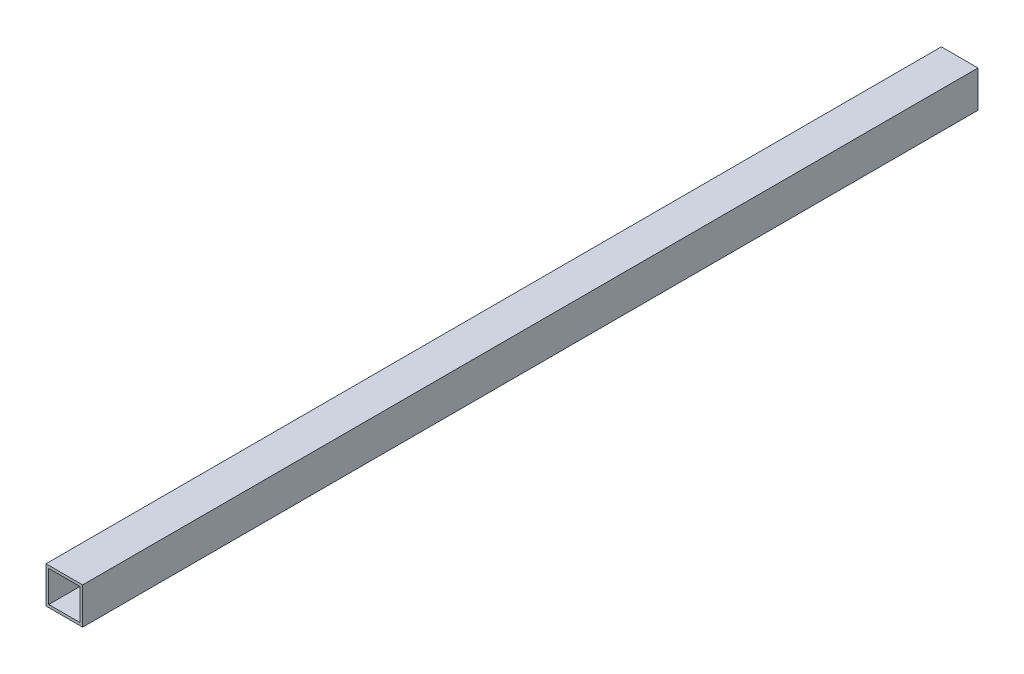
ISO-10303-21;
HEADER;
FILE_DESCRIPTION(('STEP AP214'),'2;1');
FILE_NAME('part.step','',(''),(''),'','','');
FILE_SCHEMA(('AUTOMOTIVE_DESIGN { 1 0 10303 214 1 1 1 1 }'));
ENDSEC;
DATA;
#1=APPLICATION_CONTEXT('core data for automotive mechanical design processes');
#2=APPLICATION_PROTOCOL_DEFINITION('international standard','automotive_design',2000,#1);
#3=PRODUCT_CONTEXT('',#1,'mechanical');
#4=PRODUCT('Part','Part','',(#3));
#5=PRODUCT_RELATED_PRODUCT_CATEGORY('part','',(#4));
#6=PRODUCT_DEFINITION_FORMATION('','',#4);
#7=PRODUCT_DEFINITION_CONTEXT('part definition',#1,'design');
#8=PRODUCT_DEFINITION('design','',#6,#7);
#9=PRODUCT_DEFINITION_SHAPE('','',#8);
#10=(LENGTH_UNIT() NAMED_UNIT(*) SI_UNIT(.MILLI.,.METRE.));
#11=(NAMED_UNIT(*) PLANE_ANGLE_UNIT() SI_UNIT($,.RADIAN.));
#12=(NAMED_UNIT(*) SI_UNIT($,.STERADIAN.) SOLID_ANGLE_UNIT());
#13=UNCERTAINTY_MEASURE_WITH_UNIT(LENGTH_MEASURE(1.E-05),#10,'distance_accuracy_value','');
#14=(GEOMETRIC_REPRESENTATION_CONTEXT(3) GLOBAL_UNCERTAINTY_ASSIGNED_CONTEXT((#13)) GLOBAL_UNIT_ASSIGNED_CONTEXT((#10,
#11,#12)) REPRESENTATION_CONTEXT('',''));
#15=CARTESIAN_POINT('',(0.,0.,0.));
#16=DIRECTION('',(0.,0.,1.));
#17=DIRECTION('',(1.,0.,0.));
#18=AXIS2_PLACEMENT_3D('',#15,#16,#17);
#19=CARTESIAN_POINT('',(0.,0.,250.));
#20=DIRECTION('',(0.,0.,1.));
#21=DIRECTION('',(1.,0.,0.));
#22=AXIS2_PLACEMENT_3D('',#19,#20,#21);
#23=PLANE('',#22);
#24=DIRECTION('',(0.,-1.,0.));
#25=VECTOR('',#24,1.);
#26=CARTESIAN_POINT('',(-6.75000000000053,17.5,250.));
#27=LINE('',#26,#25);
#28=CARTESIAN_POINT('',(-6.75000000000053,17.5,250.));
#29=VERTEX_POINT('',#28);
#30=CARTESIAN_POINT('',(-6.75000000000053,4.00000000000001,250.));
#31=VERTEX_POINT('',#30);
#32=EDGE_CURVE('E135',#29,#31,#27,.T.);
#33=ORIENTED_EDGE('',*,*,#32,.T.);
#34=DIRECTION('',(1.,0.,0.));
#35=VECTOR('',#34,1.);
#36=CARTESIAN_POINT('',(-6.75000000000053,4.00000000000001,250.));
#37=LINE('',#36,#35);
#38=CARTESIAN_POINT('',(6.74999999999946,4.00000000000001,250.));
#39=VERTEX_POINT('',#38);
#40=EDGE_CURVE('E138',#31,#39,#37,.T.);
#41=ORIENTED_EDGE('',*,*,#40,.T.);
#42=DIRECTION('',(0.,1.,0.));
#43=VECTOR('',#42,1.);
#44=CARTESIAN_POINT('',(6.74999999999946,17.5,250.));
#45=LINE('',#44,#43);
#46=CARTESIAN_POINT('',(6.74999999999946,17.5,250.));
#47=VERTEX_POINT('',#46);
#48=EDGE_CURVE('E141',#39,#47,#45,.T.);
#49=ORIENTED_EDGE('',*,*,#48,.T.);
#50=DIRECTION('',(-1.,0.,0.));
#51=VECTOR('',#50,1.);
#52=CARTESIAN_POINT('',(-6.75000000000053,17.5,250.));
#53=LINE('',#52,#51);
#54=EDGE_CURVE('E143',#47,#29,#53,.T.);
#55=ORIENTED_EDGE('',*,*,#54,.T.);
#56=EDGE_LOOP('',(#33,#41,#49,#55));
#57=FACE_BOUND('',#56,.T.);
#58=DIRECTION('',(1.,0.,0.));
#59=VECTOR('',#58,1.);
#60=CARTESIAN_POINT('',(-5.75000000000053,5.00000000000001,250.));
#61=LINE('',#60,#59);
#62=CARTESIAN_POINT('',(-5.75000000000053,5.00000000000001,250.));
#63=VERTEX_POINT('',#62);
#64=CARTESIAN_POINT('',(5.74999999999946,5.00000000000001,250.));
#65=VERTEX_POINT('',#64);
#66=EDGE_CURVE('E107',#63,#65,#61,.T.);
#67=ORIENTED_EDGE('',*,*,#66,.F.);
#68=DIRECTION('',(0.,-1.,0.));
#69=VECTOR('',#68,1.);
#70=CARTESIAN_POINT('',(-5.75000000000053,16.5,250.));
#71=LINE('',#70,#69);
#72=CARTESIAN_POINT('',(-5.75000000000053,16.5,250.));
#73=VERTEX_POINT('',#72);
#74=EDGE_CURVE('E99',#73,#63,#71,.T.);
#75=ORIENTED_EDGE('',*,*,#74,.F.);
#76=DIRECTION('',(-1.,0.,0.));
#77=VECTOR('',#76,1.);
#78=CARTESIAN_POINT('',(-5.75000000000053,16.5,250.));
#79=LINE('',#78,#77);
#80=CARTESIAN_POINT('',(5.74999999999946,16.5,250.));
#81=VERTEX_POINT('',#80);
#82=EDGE_CURVE('E121',#81,#73,#79,.T.);
#83=ORIENTED_EDGE('',*,*,#82,.F.);
#84=DIRECTION('',(0.,1.,0.));
#85=VECTOR('',#84,1.);
#86=CARTESIAN_POINT('',(5.74999999999946,16.5,250.));
#87=LINE('',#86,#85);
#88=EDGE_CURVE('E119',#65,#81,#87,.T.);
#89=ORIENTED_EDGE('',*,*,#88,.F.);
#90=EDGE_LOOP('',(#67,#75,#83,#89));
#91=FACE_BOUND('',#90,.T.);
#92=ADVANCED_FACE('F34',(#57,#91),#23,.T.);
#93=CARTESIAN_POINT('',(0.,0.,-80.));
#94=DIRECTION('',(0.,0.,1.));
#95=DIRECTION('',(1.,0.,0.));
#96=AXIS2_PLACEMENT_3D('',#93,#94,#95);
#97=PLANE('',#96);
#98=DIRECTION('',(0.,-1.,0.));
#99=VECTOR('',#98,1.);
#100=CARTESIAN_POINT('',(-6.75000000000053,17.5,-80.));
#101=LINE('',#100,#99);
#102=CARTESIAN_POINT('',(-6.75000000000053,17.5,-80.));
#103=VERTEX_POINT('',#102);
#104=CARTESIAN_POINT('',(-6.75000000000053,4.00000000000001,-80.));
#105=VERTEX_POINT('',#104);
#106=EDGE_CURVE('E115',#103,#105,#101,.T.);
#107=ORIENTED_EDGE('',*,*,#106,.F.);
#108=DIRECTION('',(-1.,0.,0.));
#109=VECTOR('',#108,1.);
#110=CARTESIAN_POINT('',(-6.75000000000053,17.5,-80.));
#111=LINE('',#110,#109);
#112=CARTESIAN_POINT('',(6.74999999999946,17.5,-80.));
#113=VERTEX_POINT('',#112);
#114=EDGE_CURVE('E139',#113,#103,#111,.T.);
#115=ORIENTED_EDGE('',*,*,#114,.F.);
#116=DIRECTION('',(0.,1.,0.));
#117=VECTOR('',#116,1.);
#118=CARTESIAN_POINT('',(6.74999999999946,17.5,-80.));
#119=LINE('',#118,#117);
#120=CARTESIAN_POINT('',(6.74999999999946,4.00000000000001,-80.));
#121=VERTEX_POINT('',#120);
#122=EDGE_CURVE('E150',#121,#113,#119,.T.);
#123=ORIENTED_EDGE('',*,*,#122,.F.);
#124=DIRECTION('',(1.,0.,0.));
#125=VECTOR('',#124,1.);
#126=CARTESIAN_POINT('',(-6.75000000000053,4.00000000000001,-80.));
#127=LINE('',#126,#125);
#128=EDGE_CURVE('E148',#105,#121,#127,.T.);
#129=ORIENTED_EDGE('',*,*,#128,.F.);
#130=EDGE_LOOP('',(#107,#115,#123,#129));
#131=FACE_BOUND('',#130,.T.);
#132=DIRECTION('',(0.,-1.,0.));
#133=VECTOR('',#132,1.);
#134=CARTESIAN_POINT('',(-5.75000000000053,16.5,-80.));
#135=LINE('',#134,#133);
#136=CARTESIAN_POINT('',(-5.75000000000053,16.5,-80.));
#137=VERTEX_POINT('',#136);
#138=CARTESIAN_POINT('',(-5.75000000000053,5.00000000000001,-80.));
#139=VERTEX_POINT('',#138);
#140=EDGE_CURVE('E57',#137,#139,#135,.T.);
#141=ORIENTED_EDGE('',*,*,#140,.T.);
#142=DIRECTION('',(1.,0.,0.));
#143=VECTOR('',#142,1.);
#144=CARTESIAN_POINT('',(-5.75000000000053,5.00000000000001,-80.));
#145=LINE('',#144,#143);
#146=CARTESIAN_POINT('',(5.74999999999946,5.00000000000001,-80.));
#147=VERTEX_POINT('',#146);
#148=EDGE_CURVE('E114',#139,#147,#145,.T.);
#149=ORIENTED_EDGE('',*,*,#148,.T.);
#150=DIRECTION('',(0.,1.,0.));
#151=VECTOR('',#150,1.);
#152=CARTESIAN_POINT('',(5.74999999999946,16.5,-80.));
#153=LINE('',#152,#151);
#154=CARTESIAN_POINT('',(5.74999999999946,16.5,-80.));
#155=VERTEX_POINT('',#154);
#156=EDGE_CURVE('E127',#147,#155,#153,.T.);
#157=ORIENTED_EDGE('',*,*,#156,.T.);
#158=DIRECTION('',(-1.,0.,0.));
#159=VECTOR('',#158,1.);
#160=CARTESIAN_POINT('',(-5.75000000000053,16.5,-80.));
#161=LINE('',#160,#159);
#162=EDGE_CURVE('E108',#155,#137,#161,.T.);
#163=ORIENTED_EDGE('',*,*,#162,.T.);
#164=EDGE_LOOP('',(#141,#149,#157,#163));
#165=FACE_BOUND('',#164,.T.);
#166=ADVANCED_FACE('F168',(#131,#165),#97,.F.);
#167=CARTESIAN_POINT('',(-6.75000000000053,17.5,250.));
#168=DIRECTION('',(1.,0.,0.));
#169=DIRECTION('',(0.,0.,-1.));
#170=AXIS2_PLACEMENT_3D('',#167,#168,#169);
#171=PLANE('',#170);
#172=ORIENTED_EDGE('',*,*,#106,.T.);
#173=DIRECTION('',(0.,0.,-1.));
#174=VECTOR('',#173,1.);
#175=CARTESIAN_POINT('',(-6.75000000000053,4.00000000000001,250.));
#176=LINE('',#175,#174);
#177=EDGE_CURVE('E11',#31,#105,#176,.T.);
#178=ORIENTED_EDGE('',*,*,#177,.F.);
#179=ORIENTED_EDGE('',*,*,#32,.F.);
#180=DIRECTION('',(0.,0.,-1.));
#181=VECTOR('',#180,1.);
#182=CARTESIAN_POINT('',(-6.75000000000053,17.5,250.));
#183=LINE('',#182,#181);
#184=EDGE_CURVE('E145',#29,#103,#183,.T.);
#185=ORIENTED_EDGE('',*,*,#184,.T.);
#186=EDGE_LOOP('',(#172,#178,#179,#185));
#187=FACE_BOUND('',#186,.T.);
#188=ADVANCED_FACE('F36',(#187),#171,.F.);
#189=CARTESIAN_POINT('',(-6.75000000000053,4.00000000000001,250.));
#190=DIRECTION('',(0.,1.,0.));
#191=DIRECTION('',(0.,0.,1.));
#192=AXIS2_PLACEMENT_3D('',#189,#190,#191);
#193=PLANE('',#192);
#194=ORIENTED_EDGE('',*,*,#128,.T.);
#195=DIRECTION('',(0.,0.,-1.));
#196=VECTOR('',#195,1.);
#197=CARTESIAN_POINT('',(6.74999999999946,4.00000000000001,250.));
#198=LINE('',#197,#196);
#199=EDGE_CURVE('E42',#39,#121,#198,.T.);
#200=ORIENTED_EDGE('',*,*,#199,.F.);
#201=ORIENTED_EDGE('',*,*,#40,.F.);
#202=ORIENTED_EDGE('',*,*,#177,.T.);
#203=EDGE_LOOP('',(#194,#200,#201,#202));
#204=FACE_BOUND('',#203,.T.);
#205=ADVANCED_FACE('F178',(#204),#193,.F.);
#206=CARTESIAN_POINT('',(6.74999999999946,17.5,250.));
#207=DIRECTION('',(-1.,0.,0.));
#208=DIRECTION('',(0.,0.,1.));
#209=AXIS2_PLACEMENT_3D('',#206,#207,#208);
#210=PLANE('',#209);
#211=ORIENTED_EDGE('',*,*,#122,.T.);
#212=DIRECTION('',(0.,0.,-1.));
#213=VECTOR('',#212,1.);
#214=CARTESIAN_POINT('',(6.74999999999946,17.5,250.));
#215=LINE('',#214,#213);
#216=EDGE_CURVE('E155',#47,#113,#215,.T.);
#217=ORIENTED_EDGE('',*,*,#216,.F.);
#218=ORIENTED_EDGE('',*,*,#48,.F.);
#219=ORIENTED_EDGE('',*,*,#199,.T.);
#220=EDGE_LOOP('',(#211,#217,#218,#219));
#221=FACE_BOUND('',#220,.T.);
#222=ADVANCED_FACE('F162',(#221),#210,.F.);
#223=CARTESIAN_POINT('',(-6.75000000000053,17.5,250.));
#224=DIRECTION('',(0.,-1.,0.));
#225=DIRECTION('',(0.,0.,-1.));
#226=AXIS2_PLACEMENT_3D('',#223,#224,#225);
#227=PLANE('',#226);
#228=ORIENTED_EDGE('',*,*,#114,.T.);
#229=ORIENTED_EDGE('',*,*,#184,.F.);
#230=ORIENTED_EDGE('',*,*,#54,.F.);
#231=ORIENTED_EDGE('',*,*,#216,.T.);
#232=EDGE_LOOP('',(#228,#229,#230,#231));
#233=FACE_BOUND('',#232,.T.);
#234=ADVANCED_FACE('F172',(#233),#227,.F.);
#235=CARTESIAN_POINT('',(-5.75000000000053,16.5,250.));
#236=DIRECTION('',(1.,0.,0.));
#237=DIRECTION('',(0.,1.,0.));
#238=AXIS2_PLACEMENT_3D('',#235,#236,#237);
#239=PLANE('',#238);
#240=ORIENTED_EDGE('',*,*,#140,.F.);
#241=DIRECTION('',(0.,0.,-1.));
#242=VECTOR('',#241,1.);
#243=CARTESIAN_POINT('',(-5.75000000000053,16.5,250.));
#244=LINE('',#243,#242);
#245=EDGE_CURVE('E103',#73,#137,#244,.T.);
#246=ORIENTED_EDGE('',*,*,#245,.F.);
#247=ORIENTED_EDGE('',*,*,#74,.T.);
#248=DIRECTION('',(0.,0.,-1.));
#249=VECTOR('',#248,1.);
#250=CARTESIAN_POINT('',(-5.75000000000053,5.00000000000001,250.));
#251=LINE('',#250,#249);
#252=EDGE_CURVE('E102',#63,#139,#251,.T.);
#253=ORIENTED_EDGE('',*,*,#252,.T.);
#254=EDGE_LOOP('',(#240,#246,#247,#253));
#255=FACE_BOUND('',#254,.T.);
#256=ADVANCED_FACE('F101',(#255),#239,.T.);
#257=CARTESIAN_POINT('',(-5.75000000000053,5.00000000000001,250.));
#258=DIRECTION('',(0.,1.,0.));
#259=DIRECTION('',(0.,0.,1.));
#260=AXIS2_PLACEMENT_3D('',#257,#258,#259);
#261=PLANE('',#260);
#262=ORIENTED_EDGE('',*,*,#148,.F.);
#263=ORIENTED_EDGE('',*,*,#252,.F.);
#264=ORIENTED_EDGE('',*,*,#66,.T.);
#265=DIRECTION('',(0.,0.,-1.));
#266=VECTOR('',#265,1.);
#267=CARTESIAN_POINT('',(5.74999999999946,5.00000000000001,250.));
#268=LINE('',#267,#266);
#269=EDGE_CURVE('E116',#65,#147,#268,.T.);
#270=ORIENTED_EDGE('',*,*,#269,.T.);
#271=EDGE_LOOP('',(#262,#263,#264,#270));
#272=FACE_BOUND('',#271,.T.);
#273=ADVANCED_FACE('F111',(#272),#261,.T.);
#274=CARTESIAN_POINT('',(5.74999999999946,16.5,250.));
#275=DIRECTION('',(-1.,0.,0.));
#276=DIRECTION('',(0.,-1.,0.));
#277=AXIS2_PLACEMENT_3D('',#274,#275,#276);
#278=PLANE('',#277);
#279=ORIENTED_EDGE('',*,*,#156,.F.);
#280=ORIENTED_EDGE('',*,*,#269,.F.);
#281=ORIENTED_EDGE('',*,*,#88,.T.);
#282=DIRECTION('',(0.,0.,-1.));
#283=VECTOR('',#282,1.);
#284=CARTESIAN_POINT('',(5.74999999999946,16.5,250.));
#285=LINE('',#284,#283);
#286=EDGE_CURVE('E49',#81,#155,#285,.T.);
#287=ORIENTED_EDGE('',*,*,#286,.T.);
#288=EDGE_LOOP('',(#279,#280,#281,#287));
#289=FACE_BOUND('',#288,.T.);
#290=ADVANCED_FACE('F201',(#289),#278,.T.);
#291=CARTESIAN_POINT('',(-5.75000000000053,16.5,250.));
#292=DIRECTION('',(0.,-1.,0.));
#293=DIRECTION('',(0.,0.,-1.));
#294=AXIS2_PLACEMENT_3D('',#291,#292,#293);
#295=PLANE('',#294);
#296=ORIENTED_EDGE('',*,*,#162,.F.);
#297=ORIENTED_EDGE('',*,*,#286,.F.);
#298=ORIENTED_EDGE('',*,*,#82,.T.);
#299=ORIENTED_EDGE('',*,*,#245,.T.);
#300=EDGE_LOOP('',(#296,#297,#298,#299));
#301=FACE_BOUND('',#300,.T.);
#302=ADVANCED_FACE('F205',(#301),#295,.T.);
#303=CLOSED_SHELL('',(#92,#166,#188,#205,#222,#234,#256,#273,#290,#302));
#304=MANIFOLD_SOLID_BREP('B2',#303);
#305=ADVANCED_BREP_SHAPE_REPRESENTATION('',(#18,#304),#14);
#306=SHAPE_DEFINITION_REPRESENTATION(#9,#305);
ENDSEC;
END-ISO-10303-21;
